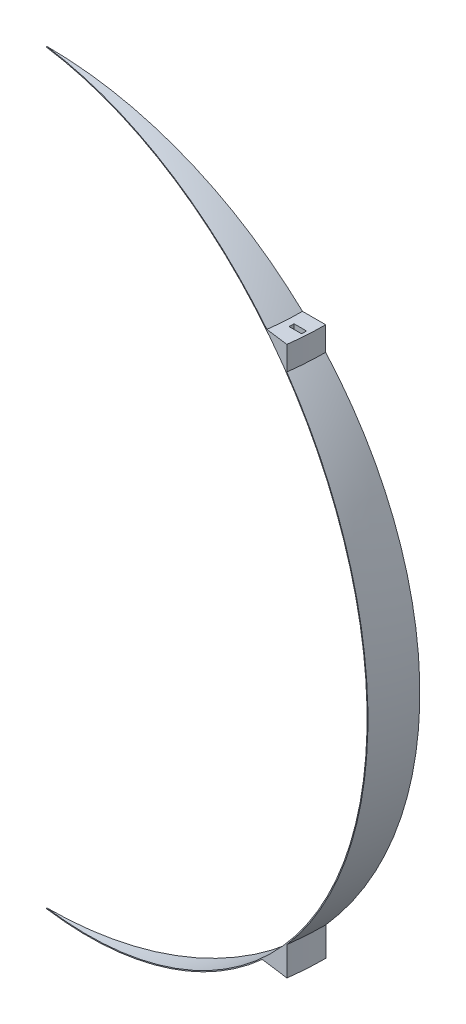
ISO-10303-21;
HEADER;
FILE_DESCRIPTION(('STEP AP214'),'2;1');
FILE_NAME('part.step','',(''),(''),'','','');
FILE_SCHEMA(('AUTOMOTIVE_DESIGN { 1 0 10303 214 1 1 1 1 }'));
ENDSEC;
DATA;
#1=APPLICATION_CONTEXT('core data for automotive mechanical design processes');
#2=APPLICATION_PROTOCOL_DEFINITION('international standard','automotive_design',2000,#1);
#3=PRODUCT_CONTEXT('',#1,'mechanical');
#4=PRODUCT('Part','Part','',(#3));
#5=PRODUCT_RELATED_PRODUCT_CATEGORY('part','',(#4));
#6=PRODUCT_DEFINITION_FORMATION('','',#4);
#7=PRODUCT_DEFINITION_CONTEXT('part definition',#1,'design');
#8=PRODUCT_DEFINITION('design','',#6,#7);
#9=PRODUCT_DEFINITION_SHAPE('','',#8);
#10=(LENGTH_UNIT() NAMED_UNIT(*) SI_UNIT(.MILLI.,.METRE.));
#11=(NAMED_UNIT(*) PLANE_ANGLE_UNIT() SI_UNIT($,.RADIAN.));
#12=(NAMED_UNIT(*) SI_UNIT($,.STERADIAN.) SOLID_ANGLE_UNIT());
#13=UNCERTAINTY_MEASURE_WITH_UNIT(LENGTH_MEASURE(1.E-05),#10,'distance_accuracy_value','');
#14=(GEOMETRIC_REPRESENTATION_CONTEXT(3) GLOBAL_UNCERTAINTY_ASSIGNED_CONTEXT((#13)) GLOBAL_UNIT_ASSIGNED_CONTEXT((#10,
#11,#12)) REPRESENTATION_CONTEXT('',''));
#15=CARTESIAN_POINT('',(0.,0.,0.));
#16=DIRECTION('',(0.,0.,1.));
#17=DIRECTION('',(1.,0.,0.));
#18=AXIS2_PLACEMENT_3D('',#15,#16,#17);
#19=CARTESIAN_POINT('',(0.,0.,0.));
#20=DIRECTION('',(0.,1.,0.));
#21=DIRECTION('',(0.99144486137381,0.,0.130526192220052));
#22=AXIS2_PLACEMENT_3D('',#19,#20,#21);
#23=SPHERICAL_SURFACE('',#22,990.6);
#24=CARTESIAN_POINT('',(0.,0.,0.));
#25=DIRECTION('',(0.,0.,-1.));
#26=DIRECTION('',(-1.,0.,0.));
#27=AXIS2_PLACEMENT_3D('',#24,#25,#26);
#28=CIRCLE('',#27,990.6);
#29=CARTESIAN_POINT('',(0.,990.6,0.));
#30=VERTEX_POINT('',#29);
#31=CARTESIAN_POINT('',(0.,-990.6,0.));
#32=VERTEX_POINT('',#31);
#33=EDGE_CURVE('E207',#30,#32,#28,.T.);
#34=ORIENTED_EDGE('',*,*,#33,.T.);
#35=CARTESIAN_POINT('',(0.,0.,0.));
#36=DIRECTION('',(0.130526192220052,0.,-0.99144486137381));
#37=DIRECTION('',(-0.99144486137381,0.,-0.130526192220052));
#38=AXIS2_PLACEMENT_3D('',#35,#36,#37);
#39=CIRCLE('',#38,990.6);
#40=EDGE_CURVE('E234',#30,#32,#39,.T.);
#41=ORIENTED_EDGE('',*,*,#40,.F.);
#42=EDGE_LOOP('',(#34,#41));
#43=FACE_BOUND('',#42,.T.);
#44=ADVANCED_FACE('F32',(#43),#23,.F.);
#45=CARTESIAN_POINT('',(0.,0.,0.));
#46=DIRECTION('',(0.,1.,0.));
#47=DIRECTION('',(0.99144486137381,0.,0.130526192220052));
#48=AXIS2_PLACEMENT_3D('',#45,#46,#47);
#49=SPHERICAL_SURFACE('',#48,993.075249624412);
#50=CARTESIAN_POINT('',(0.,722.715073962553,0.));
#51=DIRECTION('',(0.,1.,0.));
#52=DIRECTION('',(-1.,0.,0.));
#53=AXIS2_PLACEMENT_3D('',#50,#51,#52);
#54=CIRCLE('',#53,681.08837406308);
#55=CARTESIAN_POINT('',(675.261568606285,722.715073962553,88.8998720318002));
#56=VERTEX_POINT('',#55);
#57=CARTESIAN_POINT('',(681.08837406308,722.715073962553,0.));
#58=VERTEX_POINT('',#57);
#59=EDGE_CURVE('E11',#56,#58,#54,.T.);
#60=ORIENTED_EDGE('',*,*,#59,.T.);
#61=CARTESIAN_POINT('',(0.,0.,0.));
#62=DIRECTION('',(0.,0.,1.));
#63=DIRECTION('',(1.,0.,0.));
#64=AXIS2_PLACEMENT_3D('',#61,#62,#63);
#65=CIRCLE('',#64,993.075249624412);
#66=CARTESIAN_POINT('',(0.,993.075249624412,0.));
#67=VERTEX_POINT('',#66);
#68=EDGE_CURVE('E232',#58,#67,#65,.T.);
#69=ORIENTED_EDGE('',*,*,#68,.T.);
#70=CARTESIAN_POINT('',(0.,0.,0.));
#71=DIRECTION('',(-0.130526192220052,0.,0.99144486137381));
#72=DIRECTION('',(0.99144486137381,0.,0.130526192220052));
#73=AXIS2_PLACEMENT_3D('',#70,#71,#72);
#74=CIRCLE('',#73,993.075249624412);
#75=EDGE_CURVE('E258',#56,#67,#74,.T.);
#76=ORIENTED_EDGE('',*,*,#75,.F.);
#77=EDGE_LOOP('',(#60,#69,#76));
#78=FACE_BOUND('',#77,.T.);
#79=ADVANCED_FACE('F34',(#78),#49,.T.);
#80=CARTESIAN_POINT('',(736.402649131458,722.715073962553,96.9492479881314));
#81=DIRECTION('',(0.,-1.,0.));
#82=DIRECTION('',(1.,0.,0.));
#83=AXIS2_PLACEMENT_3D('',#80,#81,#82);
#84=PLANE('',#83);
#85=DIRECTION('',(-1.,0.,0.));
#86=VECTOR('',#85,1.);
#87=CARTESIAN_POINT('',(731.624743140834,722.715073962553,39.9227314072932));
#88=LINE('',#87,#86);
#89=CARTESIAN_POINT('',(731.624743140834,722.715073962553,39.9227314072932));
#90=VERTEX_POINT('',#89);
#91=CARTESIAN_POINT('',(698.374743140834,722.715073962553,39.9227314072932));
#92=VERTEX_POINT('',#91);
#93=EDGE_CURVE('E173',#90,#92,#88,.T.);
#94=ORIENTED_EDGE('',*,*,#93,.F.);
#95=DIRECTION('',(0.,0.,-1.));
#96=VECTOR('',#95,1.);
#97=CARTESIAN_POINT('',(731.624743140834,722.715073962553,39.9227314072932));
#98=LINE('',#97,#96);
#99=CARTESIAN_POINT('',(731.624743140834,722.715073962553,52.9227314072932));
#100=VERTEX_POINT('',#99);
#101=EDGE_CURVE('E47',#100,#90,#98,.T.);
#102=ORIENTED_EDGE('',*,*,#101,.F.);
#103=DIRECTION('',(1.,0.,0.));
#104=VECTOR('',#103,1.);
#105=CARTESIAN_POINT('',(731.624743140834,722.715073962553,52.9227314072932));
#106=LINE('',#105,#104);
#107=CARTESIAN_POINT('',(698.374743140834,722.715073962553,52.9227314072932));
#108=VERTEX_POINT('',#107);
#109=EDGE_CURVE('E164',#108,#100,#106,.T.);
#110=ORIENTED_EDGE('',*,*,#109,.F.);
#111=DIRECTION('',(0.,0.,1.));
#112=VECTOR('',#111,1.);
#113=CARTESIAN_POINT('',(698.374743140834,722.715073962553,39.9227314072932));
#114=LINE('',#113,#112);
#115=EDGE_CURVE('E167',#92,#108,#114,.T.);
#116=ORIENTED_EDGE('',*,*,#115,.F.);
#117=EDGE_LOOP('',(#94,#102,#110,#116));
#118=FACE_BOUND('',#117,.T.);
#119=CARTESIAN_POINT('',(0.,722.715073962553,0.));
#120=DIRECTION('',(0.,1.,0.));
#121=DIRECTION('',(-1.,0.,0.));
#122=AXIS2_PLACEMENT_3D('',#119,#120,#121);
#123=CIRCLE('',#122,742.757038561933);
#124=CARTESIAN_POINT('',(736.402649131458,722.715073962553,96.9492479881314));
#125=VERTEX_POINT('',#124);
#126=CARTESIAN_POINT('',(742.757038561933,722.715073962553,0.));
#127=VERTEX_POINT('',#126);
#128=EDGE_CURVE('E40',#125,#127,#123,.T.);
#129=ORIENTED_EDGE('',*,*,#128,.T.);
#130=DIRECTION('',(-1.,0.,0.));
#131=VECTOR('',#130,1.);
#132=CARTESIAN_POINT('',(742.757038561933,722.715073962553,0.));
#133=LINE('',#132,#131);
#134=EDGE_CURVE('E229',#127,#58,#133,.T.);
#135=ORIENTED_EDGE('',*,*,#134,.T.);
#136=ORIENTED_EDGE('',*,*,#59,.F.);
#137=DIRECTION('',(-0.99144486137381,0.,-0.130526192220052));
#138=VECTOR('',#137,1.);
#139=CARTESIAN_POINT('',(736.402649131458,722.715073962553,96.9492479881314));
#140=LINE('',#139,#138);
#141=EDGE_CURVE('E255',#125,#56,#140,.T.);
#142=ORIENTED_EDGE('',*,*,#141,.F.);
#143=EDGE_LOOP('',(#129,#135,#136,#142));
#144=FACE_BOUND('',#143,.T.);
#145=ADVANCED_FACE('F273',(#118,#144),#84,.F.);
#146=CARTESIAN_POINT('',(0.,993.075249624412,0.));
#147=DIRECTION('',(0.,1.,0.));
#148=DIRECTION('',(-1.,0.,0.));
#149=AXIS2_PLACEMENT_3D('',#146,#147,#148);
#150=CYLINDRICAL_SURFACE('',#149,742.757038561933);
#151=CARTESIAN_POINT('',(0.,659.174053709106,0.));
#152=DIRECTION('',(0.,1.,0.));
#153=DIRECTION('',(-1.,0.,0.));
#154=AXIS2_PLACEMENT_3D('',#151,#152,#153);
#155=CIRCLE('',#154,742.757038561933);
#156=CARTESIAN_POINT('',(736.402649131458,659.174053709106,96.9492479881314));
#157=VERTEX_POINT('',#156);
#158=CARTESIAN_POINT('',(742.757038561933,659.174053709106,0.));
#159=VERTEX_POINT('',#158);
#160=EDGE_CURVE('E270',#157,#159,#155,.T.);
#161=ORIENTED_EDGE('',*,*,#160,.T.);
#162=DIRECTION('',(0.,1.,0.));
#163=VECTOR('',#162,1.);
#164=CARTESIAN_POINT('',(742.757038561933,659.174053709106,0.));
#165=LINE('',#164,#163);
#166=EDGE_CURVE('E226',#159,#127,#165,.T.);
#167=ORIENTED_EDGE('',*,*,#166,.T.);
#168=ORIENTED_EDGE('',*,*,#128,.F.);
#169=DIRECTION('',(0.,1.,0.));
#170=VECTOR('',#169,1.);
#171=CARTESIAN_POINT('',(736.402649131458,659.174053709106,96.9492479881314));
#172=LINE('',#171,#170);
#173=EDGE_CURVE('E252',#157,#125,#172,.T.);
#174=ORIENTED_EDGE('',*,*,#173,.F.);
#175=EDGE_LOOP('',(#161,#167,#168,#174));
#176=FACE_BOUND('',#175,.T.);
#177=ADVANCED_FACE('F279',(#176),#150,.T.);
#178=CARTESIAN_POINT('',(0.,0.,0.));
#179=DIRECTION('',(0.,1.,0.));
#180=DIRECTION('',(0.99144486137381,0.,0.130526192220052));
#181=AXIS2_PLACEMENT_3D('',#178,#179,#180);
#182=SPHERICAL_SURFACE('',#181,993.075249624413);
#183=CARTESIAN_POINT('',(2.02009226479567E-13,-658.93051459576,0.));
#184=DIRECTION('',(0.,1.,0.));
#185=DIRECTION('',(-1.,0.,0.));
#186=AXIS2_PLACEMENT_3D('',#183,#184,#185);
#187=CIRCLE('',#186,742.97310069151);
#188=CARTESIAN_POINT('',(736.616862819564,-658.93051459576,96.977449755188));
#189=VERTEX_POINT('',#188);
#190=CARTESIAN_POINT('',(742.97310069151,-658.93051459576,0.));
#191=VERTEX_POINT('',#190);
#192=EDGE_CURVE('E268',#189,#191,#187,.T.);
#193=ORIENTED_EDGE('',*,*,#192,.T.);
#194=CARTESIAN_POINT('',(0.,0.,0.));
#195=DIRECTION('',(0.,0.,1.));
#196=DIRECTION('',(1.,0.,0.));
#197=AXIS2_PLACEMENT_3D('',#194,#195,#196);
#198=CIRCLE('',#197,993.075249624413);
#199=EDGE_CURVE('E223',#191,#159,#198,.T.);
#200=ORIENTED_EDGE('',*,*,#199,.T.);
#201=ORIENTED_EDGE('',*,*,#160,.F.);
#202=CARTESIAN_POINT('',(0.,0.,0.));
#203=DIRECTION('',(-0.130526192220052,0.,0.99144486137381));
#204=DIRECTION('',(0.99144486137381,0.,0.130526192220052));
#205=AXIS2_PLACEMENT_3D('',#202,#203,#204);
#206=CIRCLE('',#205,993.075249624413);
#207=EDGE_CURVE('E249',#189,#157,#206,.T.);
#208=ORIENTED_EDGE('',*,*,#207,.F.);
#209=EDGE_LOOP('',(#193,#200,#201,#208));
#210=FACE_BOUND('',#209,.T.);
#211=ADVANCED_FACE('F292',(#210),#182,.T.);
#212=CARTESIAN_POINT('',(0.,993.075249624412,0.));
#213=DIRECTION('',(0.,1.,0.));
#214=DIRECTION('',(-1.,0.,0.));
#215=AXIS2_PLACEMENT_3D('',#212,#213,#214);
#216=CYLINDRICAL_SURFACE('',#215,742.97310069151);
#217=CARTESIAN_POINT('',(2.11443239134794E-13,-735.965073962553,0.));
#218=DIRECTION('',(0.,1.,0.));
#219=DIRECTION('',(-1.,0.,0.));
#220=AXIS2_PLACEMENT_3D('',#217,#218,#219);
#221=CIRCLE('',#220,742.97310069151);
#222=CARTESIAN_POINT('',(736.616862819564,-735.965073962553,96.9774497551879));
#223=VERTEX_POINT('',#222);
#224=CARTESIAN_POINT('',(742.97310069151,-735.965073962553,0.));
#225=VERTEX_POINT('',#224);
#226=EDGE_CURVE('E266',#223,#225,#221,.T.);
#227=ORIENTED_EDGE('',*,*,#226,.T.);
#228=DIRECTION('',(0.,1.,0.));
#229=VECTOR('',#228,1.);
#230=CARTESIAN_POINT('',(742.97310069151,-658.93051459576,0.));
#231=LINE('',#230,#229);
#232=EDGE_CURVE('E220',#225,#191,#231,.T.);
#233=ORIENTED_EDGE('',*,*,#232,.T.);
#234=ORIENTED_EDGE('',*,*,#192,.F.);
#235=DIRECTION('',(0.,1.,0.));
#236=VECTOR('',#235,1.);
#237=CARTESIAN_POINT('',(736.616862819564,-658.93051459576,96.9774497551879));
#238=LINE('',#237,#236);
#239=EDGE_CURVE('E246',#223,#189,#238,.T.);
#240=ORIENTED_EDGE('',*,*,#239,.F.);
#241=EDGE_LOOP('',(#227,#233,#234,#240));
#242=FACE_BOUND('',#241,.T.);
#243=ADVANCED_FACE('F296',(#242),#216,.T.);
#244=CARTESIAN_POINT('',(736.616862819564,-735.965073962553,96.9774497551879));
#245=DIRECTION('',(0.,1.,0.));
#246=DIRECTION('',(-1.,0.,0.));
#247=AXIS2_PLACEMENT_3D('',#244,#245,#246);
#248=PLANE('',#247);
#249=DIRECTION('',(1.,0.,0.));
#250=VECTOR('',#249,1.);
#251=CARTESIAN_POINT('',(688.633501448751,-735.965073962553,42.5613904005498));
#252=LINE('',#251,#250);
#253=CARTESIAN_POINT('',(688.633501448751,-735.965073962553,42.5613904005498));
#254=VERTEX_POINT('',#253);
#255=CARTESIAN_POINT('',(721.883501448751,-735.965073962553,42.5613904005498));
#256=VERTEX_POINT('',#255);
#257=EDGE_CURVE('E197',#254,#256,#252,.T.);
#258=ORIENTED_EDGE('',*,*,#257,.F.);
#259=DIRECTION('',(0.,0.,-1.));
#260=VECTOR('',#259,1.);
#261=CARTESIAN_POINT('',(688.633501448751,-735.965073962553,42.5613904005498));
#262=LINE('',#261,#260);
#263=CARTESIAN_POINT('',(688.633501448751,-735.965073962553,55.5613904005498));
#264=VERTEX_POINT('',#263);
#265=EDGE_CURVE('E55',#264,#254,#262,.T.);
#266=ORIENTED_EDGE('',*,*,#265,.F.);
#267=DIRECTION('',(-1.,0.,0.));
#268=VECTOR('',#267,1.);
#269=CARTESIAN_POINT('',(688.633501448751,-735.965073962553,55.5613904005498));
#270=LINE('',#269,#268);
#271=CARTESIAN_POINT('',(721.883501448751,-735.965073962553,55.5613904005498));
#272=VERTEX_POINT('',#271);
#273=EDGE_CURVE('E186',#272,#264,#270,.T.);
#274=ORIENTED_EDGE('',*,*,#273,.F.);
#275=DIRECTION('',(0.,0.,1.));
#276=VECTOR('',#275,1.);
#277=CARTESIAN_POINT('',(721.883501448751,-735.965073962553,42.5613904005498));
#278=LINE('',#277,#276);
#279=EDGE_CURVE('E200',#256,#272,#278,.T.);
#280=ORIENTED_EDGE('',*,*,#279,.F.);
#281=EDGE_LOOP('',(#258,#266,#274,#280));
#282=FACE_BOUND('',#281,.T.);
#283=CARTESIAN_POINT('',(2.11443239134794E-13,-735.965073962553,0.));
#284=DIRECTION('',(0.,1.,0.));
#285=DIRECTION('',(-1.,0.,0.));
#286=AXIS2_PLACEMENT_3D('',#283,#284,#285);
#287=CIRCLE('',#286,666.748724276157);
#288=CARTESIAN_POINT('',(661.044596511139,-735.965073962553,87.028172147344));
#289=VERTEX_POINT('',#288);
#290=CARTESIAN_POINT('',(666.748724276157,-735.965073962553,0.));
#291=VERTEX_POINT('',#290);
#292=EDGE_CURVE('E264',#289,#291,#287,.T.);
#293=ORIENTED_EDGE('',*,*,#292,.T.);
#294=DIRECTION('',(1.,0.,0.));
#295=VECTOR('',#294,1.);
#296=CARTESIAN_POINT('',(742.97310069151,-735.965073962553,0.));
#297=LINE('',#296,#295);
#298=EDGE_CURVE('E217',#291,#225,#297,.T.);
#299=ORIENTED_EDGE('',*,*,#298,.T.);
#300=ORIENTED_EDGE('',*,*,#226,.F.);
#301=DIRECTION('',(0.99144486137381,0.,0.130526192220052));
#302=VECTOR('',#301,1.);
#303=CARTESIAN_POINT('',(736.616862819564,-735.965073962553,96.9774497551879));
#304=LINE('',#303,#302);
#305=EDGE_CURVE('E243',#289,#223,#304,.T.);
#306=ORIENTED_EDGE('',*,*,#305,.F.);
#307=EDGE_LOOP('',(#293,#299,#300,#306));
#308=FACE_BOUND('',#307,.T.);
#309=ADVANCED_FACE('F299',(#282,#308),#248,.F.);
#310=CARTESIAN_POINT('',(0.,0.,0.));
#311=DIRECTION('',(0.,1.,0.));
#312=DIRECTION('',(-0.99144486137381,0.,-0.130526192220052));
#313=AXIS2_PLACEMENT_3D('',#310,#311,#312);
#314=SPHERICAL_SURFACE('',#313,993.075249624412);
#315=CARTESIAN_POINT('',(0.,0.,0.));
#316=DIRECTION('',(0.,0.,1.));
#317=DIRECTION('',(1.,0.,0.));
#318=AXIS2_PLACEMENT_3D('',#315,#316,#317);
#319=CIRCLE('',#318,993.075249624412);
#320=CARTESIAN_POINT('',(-1.78785991861779E-13,-993.075249624412,0.));
#321=VERTEX_POINT('',#320);
#322=EDGE_CURVE('E214',#321,#291,#319,.T.);
#323=ORIENTED_EDGE('',*,*,#322,.T.);
#324=ORIENTED_EDGE('',*,*,#292,.F.);
#325=CARTESIAN_POINT('',(0.,0.,0.));
#326=DIRECTION('',(-0.130526192220052,0.,0.99144486137381));
#327=DIRECTION('',(0.99144486137381,0.,0.130526192220052));
#328=AXIS2_PLACEMENT_3D('',#325,#326,#327);
#329=CIRCLE('',#328,993.075249624412);
#330=EDGE_CURVE('E240',#321,#289,#329,.T.);
#331=ORIENTED_EDGE('',*,*,#330,.F.);
#332=EDGE_LOOP('',(#323,#324,#331));
#333=FACE_BOUND('',#332,.T.);
#334=ADVANCED_FACE('F302',(#333),#314,.T.);
#335=CARTESIAN_POINT('',(0.,0.,0.));
#336=DIRECTION('',(0.130526192220052,0.,-0.99144486137381));
#337=DIRECTION('',(-0.99144486137381,0.,-0.130526192220052));
#338=AXIS2_PLACEMENT_3D('',#335,#336,#337);
#339=PLANE('',#338);
#340=ORIENTED_EDGE('',*,*,#40,.T.);
#341=DIRECTION('',(0.,-1.,0.));
#342=VECTOR('',#341,1.);
#343=CARTESIAN_POINT('',(0.,-990.6,0.));
#344=LINE('',#343,#342);
#345=EDGE_CURVE('E237',#32,#321,#344,.T.);
#346=ORIENTED_EDGE('',*,*,#345,.T.);
#347=ORIENTED_EDGE('',*,*,#330,.T.);
#348=ORIENTED_EDGE('',*,*,#305,.T.);
#349=ORIENTED_EDGE('',*,*,#239,.T.);
#350=ORIENTED_EDGE('',*,*,#207,.T.);
#351=ORIENTED_EDGE('',*,*,#173,.T.);
#352=ORIENTED_EDGE('',*,*,#141,.T.);
#353=ORIENTED_EDGE('',*,*,#75,.T.);
#354=DIRECTION('',(0.,-1.,0.));
#355=VECTOR('',#354,1.);
#356=CARTESIAN_POINT('',(0.,993.075249624412,0.));
#357=LINE('',#356,#355);
#358=EDGE_CURVE('E261',#67,#30,#357,.T.);
#359=ORIENTED_EDGE('',*,*,#358,.T.);
#360=EDGE_LOOP('',(#340,#346,#347,#348,#349,#350,#351,#352,#353,#359));
#361=FACE_BOUND('',#360,.T.);
#362=ADVANCED_FACE('F287',(#361),#339,.F.);
#363=CARTESIAN_POINT('',(0.,0.,0.));
#364=DIRECTION('',(0.,0.,-1.));
#365=DIRECTION('',(-1.,0.,0.));
#366=AXIS2_PLACEMENT_3D('',#363,#364,#365);
#367=PLANE('',#366);
#368=ORIENTED_EDGE('',*,*,#33,.F.);
#369=ORIENTED_EDGE('',*,*,#358,.F.);
#370=ORIENTED_EDGE('',*,*,#68,.F.);
#371=ORIENTED_EDGE('',*,*,#134,.F.);
#372=ORIENTED_EDGE('',*,*,#166,.F.);
#373=ORIENTED_EDGE('',*,*,#199,.F.);
#374=ORIENTED_EDGE('',*,*,#232,.F.);
#375=ORIENTED_EDGE('',*,*,#298,.F.);
#376=ORIENTED_EDGE('',*,*,#322,.F.);
#377=ORIENTED_EDGE('',*,*,#345,.F.);
#378=EDGE_LOOP('',(#368,#369,#370,#371,#372,#373,#374,#375,#376,#377));
#379=FACE_BOUND('',#378,.T.);
#380=ADVANCED_FACE('F282',(#379),#367,.T.);
#381=CARTESIAN_POINT('',(688.633501448751,-716.965073962553,42.5613904005498));
#382=DIRECTION('',(-1.,0.,0.));
#383=DIRECTION('',(0.,-1.,0.));
#384=AXIS2_PLACEMENT_3D('',#381,#382,#383);
#385=PLANE('',#384);
#386=ORIENTED_EDGE('',*,*,#265,.T.);
#387=DIRECTION('',(0.,-1.,0.));
#388=VECTOR('',#387,1.);
#389=CARTESIAN_POINT('',(688.633501448751,-716.965073962553,42.5613904005498));
#390=LINE('',#389,#388);
#391=CARTESIAN_POINT('',(688.633501448751,-716.965073962553,42.5613904005498));
#392=VERTEX_POINT('',#391);
#393=EDGE_CURVE('E195',#392,#254,#390,.T.);
#394=ORIENTED_EDGE('',*,*,#393,.F.);
#395=DIRECTION('',(0.,0.,-1.));
#396=VECTOR('',#395,1.);
#397=CARTESIAN_POINT('',(688.633501448751,-716.965073962553,42.5613904005498));
#398=LINE('',#397,#396);
#399=CARTESIAN_POINT('',(688.633501448751,-716.965073962553,55.5613904005498));
#400=VERTEX_POINT('',#399);
#401=EDGE_CURVE('E182',#400,#392,#398,.T.);
#402=ORIENTED_EDGE('',*,*,#401,.F.);
#403=DIRECTION('',(0.,-1.,0.));
#404=VECTOR('',#403,1.);
#405=CARTESIAN_POINT('',(688.633501448751,-716.965073962553,55.5613904005498));
#406=LINE('',#405,#404);
#407=EDGE_CURVE('E205',#400,#264,#406,.T.);
#408=ORIENTED_EDGE('',*,*,#407,.T.);
#409=EDGE_LOOP('',(#386,#394,#402,#408));
#410=FACE_BOUND('',#409,.T.);
#411=ADVANCED_FACE('F354',(#410),#385,.F.);
#412=CARTESIAN_POINT('',(688.633501448751,-716.965073962553,55.5613904005498));
#413=DIRECTION('',(0.,0.,1.));
#414=DIRECTION('',(1.,0.,0.));
#415=AXIS2_PLACEMENT_3D('',#412,#413,#414);
#416=PLANE('',#415);
#417=ORIENTED_EDGE('',*,*,#273,.T.);
#418=ORIENTED_EDGE('',*,*,#407,.F.);
#419=DIRECTION('',(-1.,0.,0.));
#420=VECTOR('',#419,1.);
#421=CARTESIAN_POINT('',(688.633501448751,-716.965073962553,55.5613904005498));
#422=LINE('',#421,#420);
#423=CARTESIAN_POINT('',(721.883501448751,-716.965073962553,55.5613904005498));
#424=VERTEX_POINT('',#423);
#425=EDGE_CURVE('E192',#424,#400,#422,.T.);
#426=ORIENTED_EDGE('',*,*,#425,.F.);
#427=DIRECTION('',(0.,-1.,0.));
#428=VECTOR('',#427,1.);
#429=CARTESIAN_POINT('',(721.883501448751,-716.965073962553,55.5613904005498));
#430=LINE('',#429,#428);
#431=EDGE_CURVE('E208',#424,#272,#430,.T.);
#432=ORIENTED_EDGE('',*,*,#431,.T.);
#433=EDGE_LOOP('',(#417,#418,#426,#432));
#434=FACE_BOUND('',#433,.T.);
#435=ADVANCED_FACE('F350',(#434),#416,.F.);
#436=CARTESIAN_POINT('',(721.883501448751,-716.965073962553,42.5613904005498));
#437=DIRECTION('',(1.,0.,0.));
#438=DIRECTION('',(0.,1.,0.));
#439=AXIS2_PLACEMENT_3D('',#436,#437,#438);
#440=PLANE('',#439);
#441=ORIENTED_EDGE('',*,*,#279,.T.);
#442=ORIENTED_EDGE('',*,*,#431,.F.);
#443=DIRECTION('',(0.,0.,1.));
#444=VECTOR('',#443,1.);
#445=CARTESIAN_POINT('',(721.883501448751,-716.965073962553,42.5613904005498));
#446=LINE('',#445,#444);
#447=CARTESIAN_POINT('',(721.883501448751,-716.965073962553,42.5613904005498));
#448=VERTEX_POINT('',#447);
#449=EDGE_CURVE('E189',#448,#424,#446,.T.);
#450=ORIENTED_EDGE('',*,*,#449,.F.);
#451=DIRECTION('',(0.,-1.,0.));
#452=VECTOR('',#451,1.);
#453=CARTESIAN_POINT('',(721.883501448751,-716.965073962553,42.5613904005498));
#454=LINE('',#453,#452);
#455=EDGE_CURVE('E210',#448,#256,#454,.T.);
#456=ORIENTED_EDGE('',*,*,#455,.T.);
#457=EDGE_LOOP('',(#441,#442,#450,#456));
#458=FACE_BOUND('',#457,.T.);
#459=ADVANCED_FACE('F353',(#458),#440,.F.);
#460=CARTESIAN_POINT('',(688.633501448751,-716.965073962553,42.5613904005498));
#461=DIRECTION('',(0.,0.,-1.));
#462=DIRECTION('',(-1.,0.,0.));
#463=AXIS2_PLACEMENT_3D('',#460,#461,#462);
#464=PLANE('',#463);
#465=ORIENTED_EDGE('',*,*,#257,.T.);
#466=ORIENTED_EDGE('',*,*,#455,.F.);
#467=DIRECTION('',(1.,0.,0.));
#468=VECTOR('',#467,1.);
#469=CARTESIAN_POINT('',(688.633501448751,-716.965073962553,42.5613904005498));
#470=LINE('',#469,#468);
#471=EDGE_CURVE('E185',#392,#448,#470,.T.);
#472=ORIENTED_EDGE('',*,*,#471,.F.);
#473=ORIENTED_EDGE('',*,*,#393,.T.);
#474=EDGE_LOOP('',(#465,#466,#472,#473));
#475=FACE_BOUND('',#474,.T.);
#476=ADVANCED_FACE('F348',(#475),#464,.F.);
#477=CARTESIAN_POINT('',(0.,-716.965073962553,0.));
#478=DIRECTION('',(0.,1.,0.));
#479=DIRECTION('',(0.,0.,1.));
#480=AXIS2_PLACEMENT_3D('',#477,#478,#479);
#481=PLANE('',#480);
#482=ORIENTED_EDGE('',*,*,#401,.T.);
#483=ORIENTED_EDGE('',*,*,#471,.T.);
#484=ORIENTED_EDGE('',*,*,#449,.T.);
#485=ORIENTED_EDGE('',*,*,#425,.T.);
#486=EDGE_LOOP('',(#482,#483,#484,#485));
#487=FACE_BOUND('',#486,.T.);
#488=ADVANCED_FACE('F340',(#487),#481,.F.);
#489=CARTESIAN_POINT('',(731.624743140834,703.715073962553,39.9227314072932));
#490=DIRECTION('',(1.,0.,0.));
#491=DIRECTION('',(0.,1.,0.));
#492=AXIS2_PLACEMENT_3D('',#489,#490,#491);
#493=PLANE('',#492);
#494=ORIENTED_EDGE('',*,*,#101,.T.);
#495=DIRECTION('',(0.,1.,0.));
#496=VECTOR('',#495,1.);
#497=CARTESIAN_POINT('',(731.624743140834,703.715073962553,39.9227314072932));
#498=LINE('',#497,#496);
#499=CARTESIAN_POINT('',(731.624743140834,703.715073962553,39.9227314072932));
#500=VERTEX_POINT('',#499);
#501=EDGE_CURVE('E142',#500,#90,#498,.T.);
#502=ORIENTED_EDGE('',*,*,#501,.F.);
#503=DIRECTION('',(0.,0.,-1.));
#504=VECTOR('',#503,1.);
#505=CARTESIAN_POINT('',(731.624743140834,703.715073962553,39.9227314072932));
#506=LINE('',#505,#504);
#507=CARTESIAN_POINT('',(731.624743140834,703.715073962553,52.9227314072932));
#508=VERTEX_POINT('',#507);
#509=EDGE_CURVE('E146',#508,#500,#506,.T.);
#510=ORIENTED_EDGE('',*,*,#509,.F.);
#511=DIRECTION('',(0.,1.,0.));
#512=VECTOR('',#511,1.);
#513=CARTESIAN_POINT('',(731.624743140834,703.715073962553,52.9227314072932));
#514=LINE('',#513,#512);
#515=EDGE_CURVE('E177',#508,#100,#514,.T.);
#516=ORIENTED_EDGE('',*,*,#515,.T.);
#517=EDGE_LOOP('',(#494,#502,#510,#516));
#518=FACE_BOUND('',#517,.T.);
#519=ADVANCED_FACE('F144',(#518),#493,.F.);
#520=CARTESIAN_POINT('',(731.624743140834,703.715073962553,52.9227314072932));
#521=DIRECTION('',(0.,0.,1.));
#522=DIRECTION('',(1.,0.,0.));
#523=AXIS2_PLACEMENT_3D('',#520,#521,#522);
#524=PLANE('',#523);
#525=ORIENTED_EDGE('',*,*,#109,.T.);
#526=ORIENTED_EDGE('',*,*,#515,.F.);
#527=DIRECTION('',(1.,0.,0.));
#528=VECTOR('',#527,1.);
#529=CARTESIAN_POINT('',(731.624743140834,703.715073962553,52.9227314072932));
#530=LINE('',#529,#528);
#531=CARTESIAN_POINT('',(698.374743140834,703.715073962553,52.9227314072932));
#532=VERTEX_POINT('',#531);
#533=EDGE_CURVE('E152',#532,#508,#530,.T.);
#534=ORIENTED_EDGE('',*,*,#533,.F.);
#535=DIRECTION('',(0.,1.,0.));
#536=VECTOR('',#535,1.);
#537=CARTESIAN_POINT('',(698.374743140834,703.715073962553,52.9227314072932));
#538=LINE('',#537,#536);
#539=EDGE_CURVE('E179',#532,#108,#538,.T.);
#540=ORIENTED_EDGE('',*,*,#539,.T.);
#541=EDGE_LOOP('',(#525,#526,#534,#540));
#542=FACE_BOUND('',#541,.T.);
#543=ADVANCED_FACE('F332',(#542),#524,.F.);
#544=CARTESIAN_POINT('',(698.374743140834,703.715073962553,39.9227314072932));
#545=DIRECTION('',(-1.,0.,0.));
#546=DIRECTION('',(0.,-1.,0.));
#547=AXIS2_PLACEMENT_3D('',#544,#545,#546);
#548=PLANE('',#547);
#549=ORIENTED_EDGE('',*,*,#115,.T.);
#550=ORIENTED_EDGE('',*,*,#539,.F.);
#551=DIRECTION('',(0.,0.,1.));
#552=VECTOR('',#551,1.);
#553=CARTESIAN_POINT('',(698.374743140834,703.715073962553,39.9227314072932));
#554=LINE('',#553,#552);
#555=CARTESIAN_POINT('',(698.374743140834,703.715073962553,39.9227314072932));
#556=VERTEX_POINT('',#555);
#557=EDGE_CURVE('E160',#556,#532,#554,.T.);
#558=ORIENTED_EDGE('',*,*,#557,.F.);
#559=DIRECTION('',(0.,1.,0.));
#560=VECTOR('',#559,1.);
#561=CARTESIAN_POINT('',(698.374743140834,703.715073962553,39.9227314072932));
#562=LINE('',#561,#560);
#563=EDGE_CURVE('E151',#556,#92,#562,.T.);
#564=ORIENTED_EDGE('',*,*,#563,.T.);
#565=EDGE_LOOP('',(#549,#550,#558,#564));
#566=FACE_BOUND('',#565,.T.);
#567=ADVANCED_FACE('F330',(#566),#548,.F.);
#568=CARTESIAN_POINT('',(731.624743140834,703.715073962553,39.9227314072932));
#569=DIRECTION('',(0.,0.,-1.));
#570=DIRECTION('',(-1.,0.,0.));
#571=AXIS2_PLACEMENT_3D('',#568,#569,#570);
#572=PLANE('',#571);
#573=ORIENTED_EDGE('',*,*,#93,.T.);
#574=ORIENTED_EDGE('',*,*,#563,.F.);
#575=DIRECTION('',(-1.,0.,0.));
#576=VECTOR('',#575,1.);
#577=CARTESIAN_POINT('',(731.624743140834,703.715073962553,39.9227314072932));
#578=LINE('',#577,#576);
#579=EDGE_CURVE('E155',#500,#556,#578,.T.);
#580=ORIENTED_EDGE('',*,*,#579,.F.);
#581=ORIENTED_EDGE('',*,*,#501,.T.);
#582=EDGE_LOOP('',(#573,#574,#580,#581));
#583=FACE_BOUND('',#582,.T.);
#584=ADVANCED_FACE('F156',(#583),#572,.F.);
#585=CARTESIAN_POINT('',(0.,703.715073962553,0.));
#586=DIRECTION('',(0.,-1.,0.));
#587=DIRECTION('',(0.,0.,-1.));
#588=AXIS2_PLACEMENT_3D('',#585,#586,#587);
#589=PLANE('',#588);
#590=ORIENTED_EDGE('',*,*,#509,.T.);
#591=ORIENTED_EDGE('',*,*,#579,.T.);
#592=ORIENTED_EDGE('',*,*,#557,.T.);
#593=ORIENTED_EDGE('',*,*,#533,.T.);
#594=EDGE_LOOP('',(#590,#591,#592,#593));
#595=FACE_BOUND('',#594,.T.);
#596=ADVANCED_FACE('F162',(#595),#589,.F.);
#597=CLOSED_SHELL('',(#44,#79,#145,#177,#211,#243,#309,#334,#362,#380,#411,#435,#459,#476,#488,
#519,#543,#567,#584,#596));
#598=MANIFOLD_SOLID_BREP('B2',#597);
#599=ADVANCED_BREP_SHAPE_REPRESENTATION('',(#18,#598),#14);
#600=SHAPE_DEFINITION_REPRESENTATION(#9,#599);
ENDSEC;
END-ISO-10303-21;
